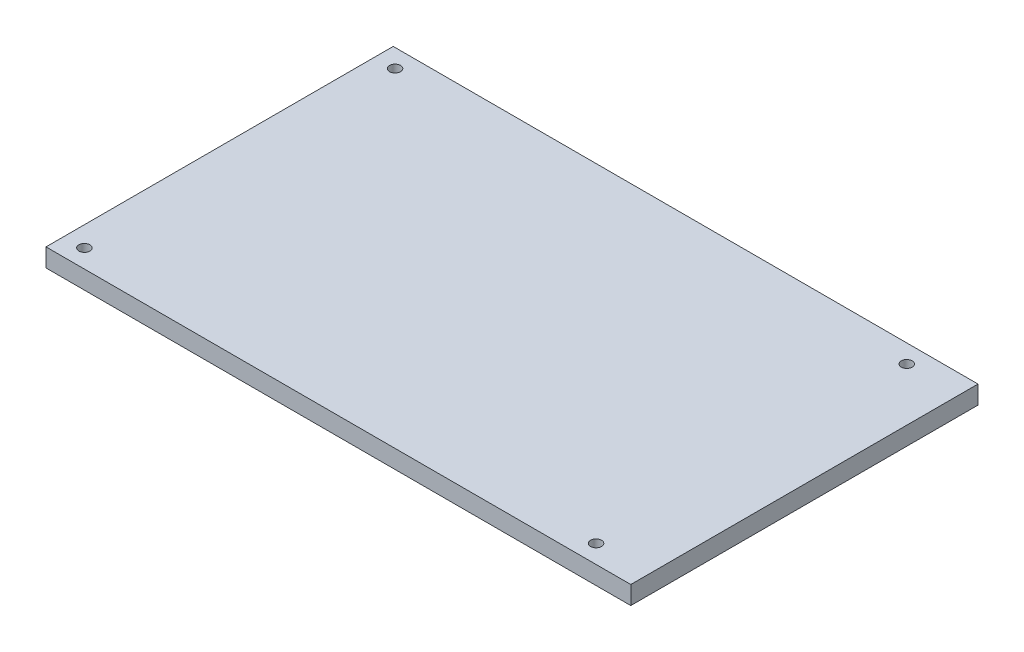
ISO-10303-21;
HEADER;
FILE_DESCRIPTION(('STEP AP214'),'2;1');
FILE_NAME('part.step','',(''),(''),'','','');
FILE_SCHEMA(('AUTOMOTIVE_DESIGN { 1 0 10303 214 1 1 1 1 }'));
ENDSEC;
DATA;
#1=APPLICATION_CONTEXT('core data for automotive mechanical design processes');
#2=APPLICATION_PROTOCOL_DEFINITION('international standard','automotive_design',2000,#1);
#3=PRODUCT_CONTEXT('',#1,'mechanical');
#4=PRODUCT('Part','Part','',(#3));
#5=PRODUCT_RELATED_PRODUCT_CATEGORY('part','',(#4));
#6=PRODUCT_DEFINITION_FORMATION('','',#4);
#7=PRODUCT_DEFINITION_CONTEXT('part definition',#1,'design');
#8=PRODUCT_DEFINITION('design','',#6,#7);
#9=PRODUCT_DEFINITION_SHAPE('','',#8);
#10=(LENGTH_UNIT() NAMED_UNIT(*) SI_UNIT(.MILLI.,.METRE.));
#11=(NAMED_UNIT(*) PLANE_ANGLE_UNIT() SI_UNIT($,.RADIAN.));
#12=(NAMED_UNIT(*) SI_UNIT($,.STERADIAN.) SOLID_ANGLE_UNIT());
#13=UNCERTAINTY_MEASURE_WITH_UNIT(LENGTH_MEASURE(1.E-05),#10,'distance_accuracy_value','');
#14=(GEOMETRIC_REPRESENTATION_CONTEXT(3) GLOBAL_UNCERTAINTY_ASSIGNED_CONTEXT((#13)) GLOBAL_UNIT_ASSIGNED_CONTEXT((#10,
#11,#12)) REPRESENTATION_CONTEXT('',''));
#15=CARTESIAN_POINT('',(0.,0.,0.));
#16=DIRECTION('',(0.,0.,1.));
#17=DIRECTION('',(1.,0.,0.));
#18=AXIS2_PLACEMENT_3D('',#15,#16,#17);
#19=CARTESIAN_POINT('',(0.,5.,0.));
#20=DIRECTION('',(1.,0.,0.));
#21=DIRECTION('',(0.,0.,-1.));
#22=AXIS2_PLACEMENT_3D('',#19,#20,#21);
#23=PLANE('',#22);
#24=DIRECTION('',(0.,0.,1.));
#25=VECTOR('',#24,1.);
#26=CARTESIAN_POINT('',(0.,0.,0.));
#27=LINE('',#26,#25);
#28=CARTESIAN_POINT('',(0.,0.,-95.));
#29=VERTEX_POINT('',#28);
#30=CARTESIAN_POINT('',(0.,0.,0.));
#31=VERTEX_POINT('',#30);
#32=EDGE_CURVE('E107',#29,#31,#27,.T.);
#33=ORIENTED_EDGE('',*,*,#32,.T.);
#34=DIRECTION('',(0.,-1.,0.));
#35=VECTOR('',#34,1.);
#36=CARTESIAN_POINT('',(0.,5.,0.));
#37=LINE('',#36,#35);
#38=CARTESIAN_POINT('',(0.,5.,0.));
#39=VERTEX_POINT('',#38);
#40=EDGE_CURVE('E11',#39,#31,#37,.T.);
#41=ORIENTED_EDGE('',*,*,#40,.F.);
#42=DIRECTION('',(0.,0.,1.));
#43=VECTOR('',#42,1.);
#44=CARTESIAN_POINT('',(0.,5.,0.));
#45=LINE('',#44,#43);
#46=CARTESIAN_POINT('',(0.,5.,-95.));
#47=VERTEX_POINT('',#46);
#48=EDGE_CURVE('E91',#47,#39,#45,.T.);
#49=ORIENTED_EDGE('',*,*,#48,.F.);
#50=DIRECTION('',(0.,-1.,0.));
#51=VECTOR('',#50,1.);
#52=CARTESIAN_POINT('',(0.,5.,-95.));
#53=LINE('',#52,#51);
#54=EDGE_CURVE('E103',#47,#29,#53,.T.);
#55=ORIENTED_EDGE('',*,*,#54,.T.);
#56=EDGE_LOOP('',(#33,#41,#49,#55));
#57=FACE_BOUND('',#56,.T.);
#58=ADVANCED_FACE('F39',(#57),#23,.F.);
#59=CARTESIAN_POINT('',(0.,5.,0.));
#60=DIRECTION('',(0.,0.,-1.));
#61=DIRECTION('',(-1.,0.,0.));
#62=AXIS2_PLACEMENT_3D('',#59,#60,#61);
#63=PLANE('',#62);
#64=DIRECTION('',(1.,0.,0.));
#65=VECTOR('',#64,1.);
#66=CARTESIAN_POINT('',(0.,0.,0.));
#67=LINE('',#66,#65);
#68=CARTESIAN_POINT('',(160.,0.,0.));
#69=VERTEX_POINT('',#68);
#70=EDGE_CURVE('E96',#31,#69,#67,.T.);
#71=ORIENTED_EDGE('',*,*,#70,.T.);
#72=DIRECTION('',(0.,-1.,0.));
#73=VECTOR('',#72,1.);
#74=CARTESIAN_POINT('',(160.,5.,0.));
#75=LINE('',#74,#73);
#76=CARTESIAN_POINT('',(160.,5.,0.));
#77=VERTEX_POINT('',#76);
#78=EDGE_CURVE('E48',#77,#69,#75,.T.);
#79=ORIENTED_EDGE('',*,*,#78,.F.);
#80=DIRECTION('',(1.,0.,0.));
#81=VECTOR('',#80,1.);
#82=CARTESIAN_POINT('',(0.,5.,0.));
#83=LINE('',#82,#81);
#84=EDGE_CURVE('E86',#39,#77,#83,.T.);
#85=ORIENTED_EDGE('',*,*,#84,.F.);
#86=ORIENTED_EDGE('',*,*,#40,.T.);
#87=EDGE_LOOP('',(#71,#79,#85,#86));
#88=FACE_BOUND('',#87,.T.);
#89=ADVANCED_FACE('F95',(#88),#63,.F.);
#90=CARTESIAN_POINT('',(160.,5.,0.));
#91=DIRECTION('',(-1.,0.,0.));
#92=DIRECTION('',(0.,0.,1.));
#93=AXIS2_PLACEMENT_3D('',#90,#91,#92);
#94=PLANE('',#93);
#95=DIRECTION('',(0.,0.,-1.));
#96=VECTOR('',#95,1.);
#97=CARTESIAN_POINT('',(160.,0.,0.));
#98=LINE('',#97,#96);
#99=CARTESIAN_POINT('',(160.,0.,-95.));
#100=VERTEX_POINT('',#99);
#101=EDGE_CURVE('E73',#69,#100,#98,.T.);
#102=ORIENTED_EDGE('',*,*,#101,.T.);
#103=DIRECTION('',(0.,-1.,0.));
#104=VECTOR('',#103,1.);
#105=CARTESIAN_POINT('',(160.,5.,-95.));
#106=LINE('',#105,#104);
#107=CARTESIAN_POINT('',(160.,5.,-95.));
#108=VERTEX_POINT('',#107);
#109=EDGE_CURVE('E98',#108,#100,#106,.T.);
#110=ORIENTED_EDGE('',*,*,#109,.F.);
#111=DIRECTION('',(0.,0.,-1.));
#112=VECTOR('',#111,1.);
#113=CARTESIAN_POINT('',(160.,5.,0.));
#114=LINE('',#113,#112);
#115=EDGE_CURVE('E89',#77,#108,#114,.T.);
#116=ORIENTED_EDGE('',*,*,#115,.F.);
#117=ORIENTED_EDGE('',*,*,#78,.T.);
#118=EDGE_LOOP('',(#102,#110,#116,#117));
#119=FACE_BOUND('',#118,.T.);
#120=ADVANCED_FACE('F99',(#119),#94,.F.);
#121=CARTESIAN_POINT('',(0.,5.,-95.));
#122=DIRECTION('',(0.,0.,1.));
#123=DIRECTION('',(1.,0.,0.));
#124=AXIS2_PLACEMENT_3D('',#121,#122,#123);
#125=PLANE('',#124);
#126=DIRECTION('',(-1.,0.,0.));
#127=VECTOR('',#126,1.);
#128=CARTESIAN_POINT('',(0.,0.,-95.));
#129=LINE('',#128,#127);
#130=EDGE_CURVE('E79',#100,#29,#129,.T.);
#131=ORIENTED_EDGE('',*,*,#130,.T.);
#132=ORIENTED_EDGE('',*,*,#54,.F.);
#133=DIRECTION('',(-1.,0.,0.));
#134=VECTOR('',#133,1.);
#135=CARTESIAN_POINT('',(0.,5.,-95.));
#136=LINE('',#135,#134);
#137=EDGE_CURVE('E56',#108,#47,#136,.T.);
#138=ORIENTED_EDGE('',*,*,#137,.F.);
#139=ORIENTED_EDGE('',*,*,#109,.T.);
#140=EDGE_LOOP('',(#131,#132,#138,#139));
#141=FACE_BOUND('',#140,.T.);
#142=ADVANCED_FACE('F121',(#141),#125,.F.);
#143=CARTESIAN_POINT('',(0.,5.,0.));
#144=DIRECTION('',(0.,-1.,0.));
#145=DIRECTION('',(0.,0.,-1.));
#146=AXIS2_PLACEMENT_3D('',#143,#144,#145);
#147=PLANE('',#146);
#148=CARTESIAN_POINT('',(5.5,5.,-5.));
#149=DIRECTION('',(0.,1.,0.));
#150=DIRECTION('',(0.,0.,-1.));
#151=AXIS2_PLACEMENT_3D('',#148,#149,#150);
#152=CIRCLE('',#151,1.5);
#153=CARTESIAN_POINT('',(5.5,5.,-6.50000000000001));
#154=VERTEX_POINT('',#153);
#155=EDGE_CURVE('E136',#154,#154,#152,.T.);
#156=ORIENTED_EDGE('',*,*,#155,.F.);
#157=EDGE_LOOP('',(#156));
#158=FACE_BOUND('',#157,.T.);
#159=CARTESIAN_POINT('',(145.5,5.,-4.99999999999999));
#160=DIRECTION('',(0.,1.,0.));
#161=DIRECTION('',(0.,0.,1.));
#162=AXIS2_PLACEMENT_3D('',#159,#160,#161);
#163=CIRCLE('',#162,1.5);
#164=CARTESIAN_POINT('',(145.5,5.,-3.49999999999999));
#165=VERTEX_POINT('',#164);
#166=EDGE_CURVE('E144',#165,#165,#163,.T.);
#167=ORIENTED_EDGE('',*,*,#166,.F.);
#168=EDGE_LOOP('',(#167));
#169=FACE_BOUND('',#168,.T.);
#170=CARTESIAN_POINT('',(145.5,5.,-90.));
#171=DIRECTION('',(0.,1.,0.));
#172=DIRECTION('',(0.,0.,-1.));
#173=AXIS2_PLACEMENT_3D('',#170,#171,#172);
#174=CIRCLE('',#173,1.5);
#175=CARTESIAN_POINT('',(145.5,5.,-91.5));
#176=VERTEX_POINT('',#175);
#177=EDGE_CURVE('E152',#176,#176,#174,.T.);
#178=ORIENTED_EDGE('',*,*,#177,.F.);
#179=EDGE_LOOP('',(#178));
#180=FACE_BOUND('',#179,.T.);
#181=CARTESIAN_POINT('',(5.5,5.,-90.));
#182=DIRECTION('',(0.,1.,0.));
#183=DIRECTION('',(0.,0.,1.));
#184=AXIS2_PLACEMENT_3D('',#181,#182,#183);
#185=CIRCLE('',#184,1.5);
#186=CARTESIAN_POINT('',(5.5,5.,-88.5));
#187=VERTEX_POINT('',#186);
#188=EDGE_CURVE('E128',#187,#187,#185,.T.);
#189=ORIENTED_EDGE('',*,*,#188,.F.);
#190=EDGE_LOOP('',(#189));
#191=FACE_BOUND('',#190,.T.);
#192=ORIENTED_EDGE('',*,*,#48,.T.);
#193=ORIENTED_EDGE('',*,*,#84,.T.);
#194=ORIENTED_EDGE('',*,*,#115,.T.);
#195=ORIENTED_EDGE('',*,*,#137,.T.);
#196=EDGE_LOOP('',(#192,#193,#194,#195));
#197=FACE_BOUND('',#196,.T.);
#198=ADVANCED_FACE('F87',(#158,#169,#180,#191,#197),#147,.F.);
#199=CARTESIAN_POINT('',(0.,0.,0.));
#200=DIRECTION('',(0.,-1.,0.));
#201=DIRECTION('',(0.,0.,-1.));
#202=AXIS2_PLACEMENT_3D('',#199,#200,#201);
#203=PLANE('',#202);
#204=CARTESIAN_POINT('',(5.5,0.,-5.));
#205=DIRECTION('',(0.,1.,0.));
#206=DIRECTION('',(0.,0.,-1.));
#207=AXIS2_PLACEMENT_3D('',#204,#205,#206);
#208=CIRCLE('',#207,1.5);
#209=CARTESIAN_POINT('',(5.5,0.,-6.50000000000001));
#210=VERTEX_POINT('',#209);
#211=EDGE_CURVE('E140',#210,#210,#208,.T.);
#212=ORIENTED_EDGE('',*,*,#211,.T.);
#213=EDGE_LOOP('',(#212));
#214=FACE_BOUND('',#213,.T.);
#215=CARTESIAN_POINT('',(145.5,0.,-4.99999999999999));
#216=DIRECTION('',(0.,1.,0.));
#217=DIRECTION('',(0.,0.,1.));
#218=AXIS2_PLACEMENT_3D('',#215,#216,#217);
#219=CIRCLE('',#218,1.5);
#220=CARTESIAN_POINT('',(145.5,0.,-3.49999999999999));
#221=VERTEX_POINT('',#220);
#222=EDGE_CURVE('E148',#221,#221,#219,.T.);
#223=ORIENTED_EDGE('',*,*,#222,.T.);
#224=EDGE_LOOP('',(#223));
#225=FACE_BOUND('',#224,.T.);
#226=CARTESIAN_POINT('',(145.5,0.,-90.));
#227=DIRECTION('',(0.,1.,0.));
#228=DIRECTION('',(0.,0.,-1.));
#229=AXIS2_PLACEMENT_3D('',#226,#227,#228);
#230=CIRCLE('',#229,1.5);
#231=CARTESIAN_POINT('',(145.5,0.,-91.5));
#232=VERTEX_POINT('',#231);
#233=EDGE_CURVE('E132',#232,#232,#230,.T.);
#234=ORIENTED_EDGE('',*,*,#233,.T.);
#235=EDGE_LOOP('',(#234));
#236=FACE_BOUND('',#235,.T.);
#237=CARTESIAN_POINT('',(5.5,0.,-90.));
#238=DIRECTION('',(0.,1.,0.));
#239=DIRECTION('',(0.,0.,1.));
#240=AXIS2_PLACEMENT_3D('',#237,#238,#239);
#241=CIRCLE('',#240,1.5);
#242=CARTESIAN_POINT('',(5.5,0.,-88.5));
#243=VERTEX_POINT('',#242);
#244=EDGE_CURVE('E111',#243,#243,#241,.T.);
#245=ORIENTED_EDGE('',*,*,#244,.T.);
#246=EDGE_LOOP('',(#245));
#247=FACE_BOUND('',#246,.T.);
#248=ORIENTED_EDGE('',*,*,#32,.F.);
#249=ORIENTED_EDGE('',*,*,#130,.F.);
#250=ORIENTED_EDGE('',*,*,#101,.F.);
#251=ORIENTED_EDGE('',*,*,#70,.F.);
#252=EDGE_LOOP('',(#248,#249,#250,#251));
#253=FACE_BOUND('',#252,.T.);
#254=ADVANCED_FACE('F124',(#214,#225,#236,#247,#253),#203,.T.);
#255=CARTESIAN_POINT('',(5.5,0.,-90.));
#256=DIRECTION('',(0.,1.,0.));
#257=DIRECTION('',(0.,0.,1.));
#258=AXIS2_PLACEMENT_3D('',#255,#256,#257);
#259=CYLINDRICAL_SURFACE('',#258,1.5);
#260=ORIENTED_EDGE('',*,*,#244,.F.);
#261=EDGE_LOOP('',(#260));
#262=FACE_BOUND('',#261,.T.);
#263=ORIENTED_EDGE('',*,*,#188,.T.);
#264=EDGE_LOOP('',(#263));
#265=FACE_BOUND('',#264,.T.);
#266=ADVANCED_FACE('F166',(#262,#265),#259,.F.);
#267=CARTESIAN_POINT('',(145.5,0.,-90.));
#268=DIRECTION('',(0.,1.,0.));
#269=DIRECTION('',(0.,0.,1.));
#270=AXIS2_PLACEMENT_3D('',#267,#268,#269);
#271=CYLINDRICAL_SURFACE('',#270,1.5);
#272=ORIENTED_EDGE('',*,*,#233,.F.);
#273=EDGE_LOOP('',(#272));
#274=FACE_BOUND('',#273,.T.);
#275=ORIENTED_EDGE('',*,*,#177,.T.);
#276=EDGE_LOOP('',(#275));
#277=FACE_BOUND('',#276,.T.);
#278=ADVANCED_FACE('F162',(#274,#277),#271,.F.);
#279=CARTESIAN_POINT('',(145.5,0.,-4.99999999999999));
#280=DIRECTION('',(0.,1.,0.));
#281=DIRECTION('',(0.,0.,1.));
#282=AXIS2_PLACEMENT_3D('',#279,#280,#281);
#283=CYLINDRICAL_SURFACE('',#282,1.5);
#284=ORIENTED_EDGE('',*,*,#222,.F.);
#285=EDGE_LOOP('',(#284));
#286=FACE_BOUND('',#285,.T.);
#287=ORIENTED_EDGE('',*,*,#166,.T.);
#288=EDGE_LOOP('',(#287));
#289=FACE_BOUND('',#288,.T.);
#290=ADVANCED_FACE('F165',(#286,#289),#283,.F.);
#291=CARTESIAN_POINT('',(5.5,0.,-5.));
#292=DIRECTION('',(0.,1.,0.));
#293=DIRECTION('',(0.,0.,1.));
#294=AXIS2_PLACEMENT_3D('',#291,#292,#293);
#295=CYLINDRICAL_SURFACE('',#294,1.5);
#296=ORIENTED_EDGE('',*,*,#211,.F.);
#297=EDGE_LOOP('',(#296));
#298=FACE_BOUND('',#297,.T.);
#299=ORIENTED_EDGE('',*,*,#155,.T.);
#300=EDGE_LOOP('',(#299));
#301=FACE_BOUND('',#300,.T.);
#302=ADVANCED_FACE('F227',(#298,#301),#295,.F.);
#303=CLOSED_SHELL('',(#58,#89,#120,#142,#198,#254,#266,#278,#290,#302));
#304=MANIFOLD_SOLID_BREP('B2',#303);
#305=ADVANCED_BREP_SHAPE_REPRESENTATION('',(#18,#304),#14);
#306=SHAPE_DEFINITION_REPRESENTATION(#9,#305);
ENDSEC;
END-ISO-10303-21;
